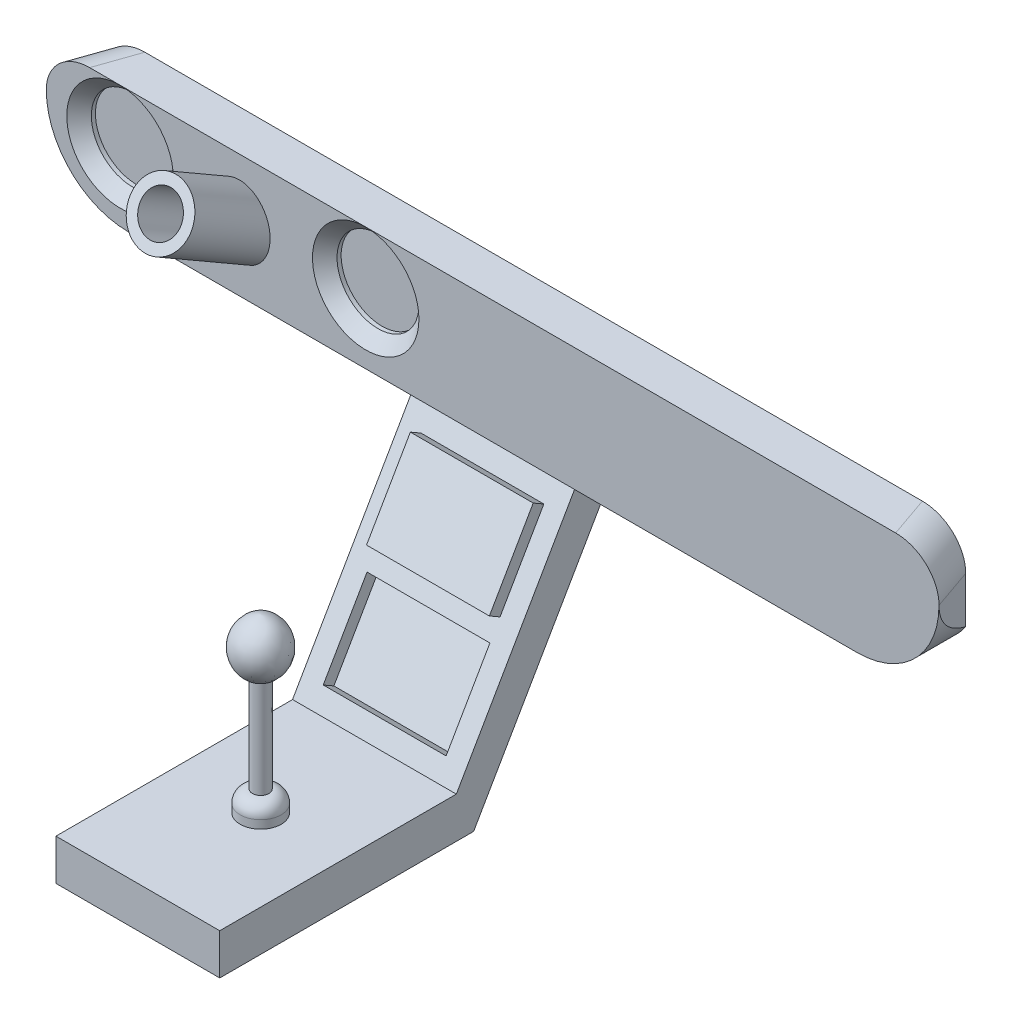
ISO-10303-21;
HEADER;
FILE_DESCRIPTION(('STEP AP214'),'2;1');
FILE_NAME('part.step','',(''),(''),'','','');
FILE_SCHEMA(('AUTOMOTIVE_DESIGN { 1 0 10303 214 1 1 1 1 }'));
ENDSEC;
DATA;
#1=APPLICATION_CONTEXT('core data for automotive mechanical design processes');
#2=APPLICATION_PROTOCOL_DEFINITION('international standard','automotive_design',2000,#1);
#3=PRODUCT_CONTEXT('',#1,'mechanical');
#4=PRODUCT('Part','Part','',(#3));
#5=PRODUCT_RELATED_PRODUCT_CATEGORY('part','',(#4));
#6=PRODUCT_DEFINITION_FORMATION('','',#4);
#7=PRODUCT_DEFINITION_CONTEXT('part definition',#1,'design');
#8=PRODUCT_DEFINITION('design','',#6,#7);
#9=PRODUCT_DEFINITION_SHAPE('','',#8);
#10=(LENGTH_UNIT() NAMED_UNIT(*) SI_UNIT(.MILLI.,.METRE.));
#11=(NAMED_UNIT(*) PLANE_ANGLE_UNIT() SI_UNIT($,.RADIAN.));
#12=(NAMED_UNIT(*) SI_UNIT($,.STERADIAN.) SOLID_ANGLE_UNIT());
#13=UNCERTAINTY_MEASURE_WITH_UNIT(LENGTH_MEASURE(1.E-05),#10,'distance_accuracy_value','');
#14=(GEOMETRIC_REPRESENTATION_CONTEXT(3) GLOBAL_UNCERTAINTY_ASSIGNED_CONTEXT((#13)) GLOBAL_UNIT_ASSIGNED_CONTEXT((#10,
#11,#12)) REPRESENTATION_CONTEXT('',''));
#15=CARTESIAN_POINT('',(0.,0.,0.));
#16=DIRECTION('',(0.,0.,1.));
#17=DIRECTION('',(1.,0.,0.));
#18=AXIS2_PLACEMENT_3D('',#15,#16,#17);
#19=CARTESIAN_POINT('',(109.,15.,5.));
#20=DIRECTION('',(0.,-1.,0.));
#21=DIRECTION('',(1.,0.,0.));
#22=AXIS2_PLACEMENT_3D('',#19,#20,#21);
#23=PLANE('',#22);
#24=DIRECTION('',(-1.,0.,0.));
#25=VECTOR('',#24,1.);
#26=CARTESIAN_POINT('',(109.,15.,5.));
#27=LINE('',#26,#25);
#28=CARTESIAN_POINT('',(98.4117801307302,15.,5.));
#29=VERTEX_POINT('',#28);
#30=CARTESIAN_POINT('',(-31.,15.,5.));
#31=VERTEX_POINT('',#30);
#32=EDGE_CURVE('E213',#29,#31,#27,.T.);
#33=ORIENTED_EDGE('',*,*,#32,.F.);
#34=DIRECTION('',(-0.328667145466067,0.,-0.94444582030479));
#35=VECTOR('',#34,1.);
#36=CARTESIAN_POINT('',(96.0755417969521,15.,-1.71332854533933));
#37=LINE('',#36,#35);
#38=CARTESIAN_POINT('',(94.9317801307302,15.,-5.));
#39=VERTEX_POINT('',#38);
#40=EDGE_CURVE('E195',#29,#39,#37,.T.);
#41=ORIENTED_EDGE('',*,*,#40,.T.);
#42=DIRECTION('',(-1.,0.,0.));
#43=VECTOR('',#42,1.);
#44=CARTESIAN_POINT('',(109.,15.,-5.));
#45=LINE('',#44,#43);
#46=CARTESIAN_POINT('',(-94.9317801307302,15.,-5.));
#47=VERTEX_POINT('',#46);
#48=EDGE_CURVE('E257',#39,#47,#45,.T.);
#49=ORIENTED_EDGE('',*,*,#48,.T.);
#50=DIRECTION('',(0.328667145466067,0.,-0.94444582030479));
#51=VECTOR('',#50,1.);
#52=CARTESIAN_POINT('',(-76.006725630031,15.,-59.3823405192507));
#53=LINE('',#52,#51);
#54=CARTESIAN_POINT('',(-98.4117801307302,15.,5.));
#55=VERTEX_POINT('',#54);
#56=EDGE_CURVE('E250',#47,#55,#53,.F.);
#57=ORIENTED_EDGE('',*,*,#56,.T.);
#58=CARTESIAN_POINT('',(-91.,15.,5.));
#59=VERTEX_POINT('',#58);
#60=EDGE_CURVE('E271',#59,#55,#27,.T.);
#61=ORIENTED_EDGE('',*,*,#60,.F.);
#62=EDGE_CURVE('E270',#31,#59,#27,.T.);
#63=ORIENTED_EDGE('',*,*,#62,.F.);
#64=EDGE_LOOP('',(#33,#41,#49,#57,#61,#63));
#65=FACE_BOUND('',#64,.T.);
#66=ADVANCED_FACE('F37',(#65),#23,.F.);
#67=CARTESIAN_POINT('',(0.,0.,-5.));
#68=DIRECTION('',(0.,0.,1.));
#69=DIRECTION('',(1.,0.,0.));
#70=AXIS2_PLACEMENT_3D('',#67,#68,#69);
#71=PLANE('',#70);
#72=CARTESIAN_POINT('',(-61.85,-4.8867513459481,-5.));
#73=DIRECTION('',(0.,0.,1.));
#74=DIRECTION('',(0.,1.,0.));
#75=AXIS2_PLACEMENT_3D('',#72,#73,#74);
#76=ELLIPSE('',#75,8.66025403784438,7.50000000000001);
#77=CARTESIAN_POINT('',(-61.85,3.77350269189628,-5.));
#78=VERTEX_POINT('',#77);
#79=EDGE_CURVE('E234',#78,#78,#76,.F.);
#80=ORIENTED_EDGE('',*,*,#79,.F.);
#81=EDGE_LOOP('',(#80));
#82=FACE_BOUND('',#81,.T.);
#83=ORIENTED_EDGE('',*,*,#48,.F.);
#84=CARTESIAN_POINT('',(94.9317801307302,5.00000000000001,-5.));
#85=DIRECTION('',(0.,0.,1.));
#86=DIRECTION('',(1.,0.,0.));
#87=AXIS2_PLACEMENT_3D('',#84,#85,#86);
#88=ELLIPSE('',#87,10.5882198692698,10.);
#89=CARTESIAN_POINT('',(105.52,5.00000000000001,-5.));
#90=VERTEX_POINT('',#89);
#91=EDGE_CURVE('E52',#39,#90,#88,.F.);
#92=ORIENTED_EDGE('',*,*,#91,.T.);
#93=DIRECTION('',(0.,1.,0.));
#94=VECTOR('',#93,1.);
#95=CARTESIAN_POINT('',(105.52,-25.,-5.));
#96=LINE('',#95,#94);
#97=CARTESIAN_POINT('',(105.52,-6.27340232582859,-5.));
#98=VERTEX_POINT('',#97);
#99=EDGE_CURVE('E190',#98,#90,#96,.T.);
#100=ORIENTED_EDGE('',*,*,#99,.F.);
#101=CARTESIAN_POINT('',(89.,5.00000000000002,-5.));
#102=DIRECTION('',(0.,0.,1.));
#103=DIRECTION('',(1.,0.,0.));
#104=AXIS2_PLACEMENT_3D('',#101,#102,#103);
#105=CIRCLE('',#104,20.);
#106=CARTESIAN_POINT('',(89.,-15.,-5.));
#107=VERTEX_POINT('',#106);
#108=EDGE_CURVE('E199',#98,#107,#105,.F.);
#109=ORIENTED_EDGE('',*,*,#108,.T.);
#110=DIRECTION('',(1.,0.,0.));
#111=VECTOR('',#110,1.);
#112=CARTESIAN_POINT('',(109.,-15.,-5.));
#113=LINE('',#112,#111);
#114=CARTESIAN_POINT('',(20.,-15.,-5.));
#115=VERTEX_POINT('',#114);
#116=EDGE_CURVE('E267',#115,#107,#113,.T.);
#117=ORIENTED_EDGE('',*,*,#116,.F.);
#118=DIRECTION('',(-1.,0.,0.));
#119=VECTOR('',#118,1.);
#120=CARTESIAN_POINT('',(20.,-15.,-5.));
#121=LINE('',#120,#119);
#122=CARTESIAN_POINT('',(-20.,-15.,-5.));
#123=VERTEX_POINT('',#122);
#124=EDGE_CURVE('E295',#115,#123,#121,.T.);
#125=ORIENTED_EDGE('',*,*,#124,.T.);
#126=CARTESIAN_POINT('',(-89.,-15.,-5.));
#127=VERTEX_POINT('',#126);
#128=EDGE_CURVE('E263',#127,#123,#113,.T.);
#129=ORIENTED_EDGE('',*,*,#128,.F.);
#130=CARTESIAN_POINT('',(-89.,4.99999999999999,-5.));
#131=DIRECTION('',(0.,0.,1.));
#132=DIRECTION('',(1.,0.,0.));
#133=AXIS2_PLACEMENT_3D('',#130,#131,#132);
#134=CIRCLE('',#133,20.);
#135=CARTESIAN_POINT('',(-105.52,-6.27340232582872,-5.));
#136=VERTEX_POINT('',#135);
#137=EDGE_CURVE('E208',#127,#136,#134,.F.);
#138=ORIENTED_EDGE('',*,*,#137,.T.);
#139=DIRECTION('',(0.,1.,0.));
#140=VECTOR('',#139,1.);
#141=CARTESIAN_POINT('',(-105.52,-25.,-5.));
#142=LINE('',#141,#140);
#143=CARTESIAN_POINT('',(-105.52,4.99999999999999,-5.));
#144=VERTEX_POINT('',#143);
#145=EDGE_CURVE('E201',#136,#144,#142,.T.);
#146=ORIENTED_EDGE('',*,*,#145,.T.);
#147=CARTESIAN_POINT('',(-94.9317801307302,4.99999999999999,-5.));
#148=DIRECTION('',(0.,0.,1.));
#149=DIRECTION('',(1.,0.,0.));
#150=AXIS2_PLACEMENT_3D('',#147,#148,#149);
#151=ELLIPSE('',#150,10.5882198692698,10.);
#152=EDGE_CURVE('E247',#144,#47,#151,.F.);
#153=ORIENTED_EDGE('',*,*,#152,.T.);
#154=EDGE_LOOP('',(#83,#92,#100,#109,#117,#125,#129,#138,#146,#153));
#155=FACE_BOUND('',#154,.T.);
#156=ADVANCED_FACE('F198',(#82,#155),#71,.F.);
#157=CARTESIAN_POINT('',(89.,5.00000000000002,5.));
#158=DIRECTION('',(0.,0.,-1.));
#159=DIRECTION('',(-1.,0.,0.));
#160=AXIS2_PLACEMENT_3D('',#157,#158,#159);
#161=CYLINDRICAL_SURFACE('',#160,20.);
#162=ORIENTED_EDGE('',*,*,#108,.F.);
#163=CARTESIAN_POINT('',(89.,5.00000000000002,-52.4712643678163));
#164=DIRECTION('',(0.94444582030479,0.,-0.328667145466067));
#165=DIRECTION('',(-0.328667145466067,0.,-0.94444582030479));
#166=AXIS2_PLACEMENT_3D('',#163,#164,#165);
#167=ELLIPSE('',#166,60.8518383291369,20.);
#168=CARTESIAN_POINT('',(109.,5.00000000000002,5.));
#169=VERTEX_POINT('',#168);
#170=EDGE_CURVE('E188',#98,#169,#167,.F.);
#171=ORIENTED_EDGE('',*,*,#170,.T.);
#172=CARTESIAN_POINT('',(89.,5.00000000000002,5.));
#173=DIRECTION('',(0.,0.,1.));
#174=DIRECTION('',(1.,0.,0.));
#175=AXIS2_PLACEMENT_3D('',#172,#173,#174);
#176=CIRCLE('',#175,20.);
#177=CARTESIAN_POINT('',(89.,-15.,5.));
#178=VERTEX_POINT('',#177);
#179=EDGE_CURVE('E220',#178,#169,#176,.T.);
#180=ORIENTED_EDGE('',*,*,#179,.F.);
#181=DIRECTION('',(0.,0.,-1.));
#182=VECTOR('',#181,1.);
#183=CARTESIAN_POINT('',(89.,-15.,5.));
#184=LINE('',#183,#182);
#185=EDGE_CURVE('E206',#107,#178,#184,.F.);
#186=ORIENTED_EDGE('',*,*,#185,.F.);
#187=EDGE_LOOP('',(#162,#171,#180,#186));
#188=FACE_BOUND('',#187,.T.);
#189=ADVANCED_FACE('F204',(#188),#161,.T.);
#190=CARTESIAN_POINT('',(20.,-15.,5.));
#191=DIRECTION('',(0.,-0.499999999999998,-0.86602540378444));
#192=DIRECTION('',(0.,0.86602540378444,-0.499999999999998));
#193=AXIS2_PLACEMENT_3D('',#190,#191,#192);
#194=PLANE('',#193);
#195=DIRECTION('',(0.,-0.86602540378444,0.499999999999998));
#196=VECTOR('',#195,1.);
#197=CARTESIAN_POINT('',(-20.,-15.,5.));
#198=LINE('',#197,#196);
#199=CARTESIAN_POINT('',(-20.,-15.,5.));
#200=VERTEX_POINT('',#199);
#201=CARTESIAN_POINT('',(-20.,-65.,33.8675134594811));
#202=VERTEX_POINT('',#201);
#203=EDGE_CURVE('E320',#200,#202,#198,.T.);
#204=ORIENTED_EDGE('',*,*,#203,.T.);
#205=DIRECTION('',(-1.,0.,0.));
#206=VECTOR('',#205,1.);
#207=CARTESIAN_POINT('',(20.,-65.,33.8675134594811));
#208=LINE('',#207,#206);
#209=CARTESIAN_POINT('',(20.,-65.,33.8675134594811));
#210=VERTEX_POINT('',#209);
#211=EDGE_CURVE('E300',#210,#202,#208,.T.);
#212=ORIENTED_EDGE('',*,*,#211,.F.);
#213=DIRECTION('',(0.,-0.86602540378444,0.499999999999998));
#214=VECTOR('',#213,1.);
#215=CARTESIAN_POINT('',(20.,-15.,5.));
#216=LINE('',#215,#214);
#217=CARTESIAN_POINT('',(20.,-15.,5.));
#218=VERTEX_POINT('',#217);
#219=EDGE_CURVE('E333',#218,#210,#216,.T.);
#220=ORIENTED_EDGE('',*,*,#219,.F.);
#221=DIRECTION('',(-1.,0.,0.));
#222=VECTOR('',#221,1.);
#223=CARTESIAN_POINT('',(20.,-15.,5.));
#224=LINE('',#223,#222);
#225=EDGE_CURVE('E297',#218,#200,#224,.T.);
#226=ORIENTED_EDGE('',*,*,#225,.T.);
#227=EDGE_LOOP('',(#204,#212,#220,#226));
#228=FACE_BOUND('',#227,.T.);
#229=DIRECTION('',(-1.,0.,0.));
#230=VECTOR('',#229,1.);
#231=CARTESIAN_POINT('',(0.,-37.8630706599092,18.1999999999999));
#232=LINE('',#231,#230);
#233=CARTESIAN_POINT('',(15.,-37.8630706599092,18.1999999999999));
#234=VERTEX_POINT('',#233);
#235=CARTESIAN_POINT('',(-15.,-37.8630706599092,18.1999999999999));
#236=VERTEX_POINT('',#235);
#237=EDGE_CURVE('E359',#234,#236,#232,.T.);
#238=ORIENTED_EDGE('',*,*,#237,.T.);
#239=DIRECTION('',(0.,0.86602540378444,-0.499999999999998));
#240=VECTOR('',#239,1.);
#241=CARTESIAN_POINT('',(-15.,-1.58493649053887,-2.74519052838325));
#242=LINE('',#241,#240);
#243=CARTESIAN_POINT('',(-15.,-19.3301270189222,7.49999999999999));
#244=VERTEX_POINT('',#243);
#245=EDGE_CURVE('E361',#236,#244,#242,.T.);
#246=ORIENTED_EDGE('',*,*,#245,.T.);
#247=DIRECTION('',(-1.,0.,0.));
#248=VECTOR('',#247,1.);
#249=CARTESIAN_POINT('',(0.,-19.3301270189222,7.49999999999999));
#250=LINE('',#249,#248);
#251=CARTESIAN_POINT('',(15.,-19.3301270189222,7.49999999999999));
#252=VERTEX_POINT('',#251);
#253=EDGE_CURVE('E352',#252,#244,#250,.T.);
#254=ORIENTED_EDGE('',*,*,#253,.F.);
#255=DIRECTION('',(0.,0.86602540378444,-0.499999999999998));
#256=VECTOR('',#255,1.);
#257=CARTESIAN_POINT('',(15.,-1.58493649053887,-2.74519052838325));
#258=LINE('',#257,#256);
#259=EDGE_CURVE('E356',#234,#252,#258,.T.);
#260=ORIENTED_EDGE('',*,*,#259,.F.);
#261=EDGE_LOOP('',(#238,#246,#254,#260));
#262=FACE_BOUND('',#261,.T.);
#263=DIRECTION('',(0.,0.86602540378444,-0.499999999999998));
#264=VECTOR('',#263,1.);
#265=CARTESIAN_POINT('',(-15.,-1.58493649053887,-2.74519052838325));
#266=LINE('',#265,#264);
#267=CARTESIAN_POINT('',(-15.,-60.6698729810778,31.3675134594811));
#268=VERTEX_POINT('',#267);
#269=CARTESIAN_POINT('',(-15.,-42.1369293400908,20.6675134594812));
#270=VERTEX_POINT('',#269);
#271=EDGE_CURVE('E391',#268,#270,#266,.T.);
#272=ORIENTED_EDGE('',*,*,#271,.T.);
#273=DIRECTION('',(-1.,0.,0.));
#274=VECTOR('',#273,1.);
#275=CARTESIAN_POINT('',(0.,-42.1369293400908,20.6675134594812));
#276=LINE('',#275,#274);
#277=CARTESIAN_POINT('',(15.,-42.1369293400908,20.6675134594812));
#278=VERTEX_POINT('',#277);
#279=EDGE_CURVE('E381',#278,#270,#276,.T.);
#280=ORIENTED_EDGE('',*,*,#279,.F.);
#281=DIRECTION('',(0.,0.86602540378444,-0.499999999999998));
#282=VECTOR('',#281,1.);
#283=CARTESIAN_POINT('',(15.,-1.58493649053887,-2.74519052838325));
#284=LINE('',#283,#282);
#285=CARTESIAN_POINT('',(15.,-60.6698729810778,31.3675134594811));
#286=VERTEX_POINT('',#285);
#287=EDGE_CURVE('E385',#286,#278,#284,.T.);
#288=ORIENTED_EDGE('',*,*,#287,.F.);
#289=DIRECTION('',(-1.,0.,0.));
#290=VECTOR('',#289,1.);
#291=CARTESIAN_POINT('',(0.,-60.6698729810778,31.3675134594811));
#292=LINE('',#291,#290);
#293=EDGE_CURVE('E388',#286,#268,#292,.T.);
#294=ORIENTED_EDGE('',*,*,#293,.T.);
#295=EDGE_LOOP('',(#272,#280,#288,#294));
#296=FACE_BOUND('',#295,.T.);
#297=ADVANCED_FACE('F474',(#228,#262,#296),#194,.F.);
#298=CARTESIAN_POINT('',(109.,-15.,5.));
#299=DIRECTION('',(0.,1.,0.));
#300=DIRECTION('',(-1.,0.,0.));
#301=AXIS2_PLACEMENT_3D('',#298,#299,#300);
#302=PLANE('',#301);
#303=DIRECTION('',(0.,0.,1.));
#304=VECTOR('',#303,1.);
#305=CARTESIAN_POINT('',(20.,-15.,-5.));
#306=LINE('',#305,#304);
#307=EDGE_CURVE('E335',#115,#218,#306,.T.);
#308=ORIENTED_EDGE('',*,*,#307,.F.);
#309=ORIENTED_EDGE('',*,*,#116,.T.);
#310=ORIENTED_EDGE('',*,*,#185,.T.);
#311=DIRECTION('',(1.,0.,0.));
#312=VECTOR('',#311,1.);
#313=CARTESIAN_POINT('',(109.,-15.,5.));
#314=LINE('',#313,#312);
#315=EDGE_CURVE('E262',#218,#178,#314,.T.);
#316=ORIENTED_EDGE('',*,*,#315,.F.);
#317=EDGE_LOOP('',(#308,#309,#310,#316));
#318=FACE_BOUND('',#317,.T.);
#319=ADVANCED_FACE('F470',(#318),#302,.F.);
#320=ORIENTED_EDGE('',*,*,#128,.T.);
#321=DIRECTION('',(0.,0.,1.));
#322=VECTOR('',#321,1.);
#323=CARTESIAN_POINT('',(-20.,-15.,-5.));
#324=LINE('',#323,#322);
#325=EDGE_CURVE('E322',#123,#200,#324,.T.);
#326=ORIENTED_EDGE('',*,*,#325,.T.);
#327=CARTESIAN_POINT('',(-89.,-15.,5.));
#328=VERTEX_POINT('',#327);
#329=EDGE_CURVE('E264',#328,#200,#314,.T.);
#330=ORIENTED_EDGE('',*,*,#329,.F.);
#331=DIRECTION('',(0.,0.,-1.));
#332=VECTOR('',#331,1.);
#333=CARTESIAN_POINT('',(-89.,-15.,5.));
#334=LINE('',#333,#332);
#335=EDGE_CURVE('E207',#328,#127,#334,.T.);
#336=ORIENTED_EDGE('',*,*,#335,.T.);
#337=EDGE_LOOP('',(#320,#326,#330,#336));
#338=FACE_BOUND('',#337,.T.);
#339=ADVANCED_FACE('F467',(#338),#302,.F.);
#340=CARTESIAN_POINT('',(0.,0.,5.));
#341=DIRECTION('',(0.,0.,1.));
#342=DIRECTION('',(1.,0.,0.));
#343=AXIS2_PLACEMENT_3D('',#340,#341,#342);
#344=PLANE('',#343);
#345=CARTESIAN_POINT('',(-61.85,0.886751345948126,5.));
#346=DIRECTION('',(0.,0.,1.));
#347=DIRECTION('',(0.,1.,0.));
#348=AXIS2_PLACEMENT_3D('',#345,#346,#347);
#349=ELLIPSE('',#348,8.66025403784438,7.50000000000001);
#350=CARTESIAN_POINT('',(-61.85,9.5470053837925,5.));
#351=VERTEX_POINT('',#350);
#352=EDGE_CURVE('E278',#351,#351,#349,.F.);
#353=ORIENTED_EDGE('',*,*,#352,.T.);
#354=EDGE_LOOP('',(#353));
#355=FACE_BOUND('',#354,.T.);
#356=ORIENTED_EDGE('',*,*,#179,.T.);
#357=CARTESIAN_POINT('',(98.4117801307302,5.00000000000001,5.));
#358=DIRECTION('',(0.,0.,1.));
#359=DIRECTION('',(1.,0.,0.));
#360=AXIS2_PLACEMENT_3D('',#357,#358,#359);
#361=ELLIPSE('',#360,10.5882198692698,10.);
#362=EDGE_CURVE('E11',#169,#29,#361,.T.);
#363=ORIENTED_EDGE('',*,*,#362,.T.);
#364=ORIENTED_EDGE('',*,*,#32,.T.);
#365=CARTESIAN_POINT('',(-31.,2.00000000000002,5.));
#366=DIRECTION('',(0.,0.,1.));
#367=DIRECTION('',(1.,0.,0.));
#368=AXIS2_PLACEMENT_3D('',#365,#366,#367);
#369=CIRCLE('',#368,13.0000000000001);
#370=EDGE_CURVE('E228',#31,#31,#369,.F.);
#371=ORIENTED_EDGE('',*,*,#370,.T.);
#372=ORIENTED_EDGE('',*,*,#62,.T.);
#373=CARTESIAN_POINT('',(-91.,2.00000000000002,5.));
#374=DIRECTION('',(0.,0.,1.));
#375=DIRECTION('',(1.,0.,0.));
#376=AXIS2_PLACEMENT_3D('',#373,#374,#375);
#377=CIRCLE('',#376,13.0000000000001);
#378=EDGE_CURVE('E225',#59,#59,#377,.F.);
#379=ORIENTED_EDGE('',*,*,#378,.T.);
#380=ORIENTED_EDGE('',*,*,#60,.T.);
#381=CARTESIAN_POINT('',(-98.4117801307302,4.99999999999999,5.));
#382=DIRECTION('',(0.,0.,1.));
#383=DIRECTION('',(1.,0.,0.));
#384=AXIS2_PLACEMENT_3D('',#381,#382,#383);
#385=ELLIPSE('',#384,10.5882198692698,10.);
#386=CARTESIAN_POINT('',(-109.,4.99999999999999,5.));
#387=VERTEX_POINT('',#386);
#388=EDGE_CURVE('E196',#55,#387,#385,.T.);
#389=ORIENTED_EDGE('',*,*,#388,.T.);
#390=CARTESIAN_POINT('',(-89.,4.99999999999999,5.));
#391=DIRECTION('',(0.,0.,1.));
#392=DIRECTION('',(1.,0.,0.));
#393=AXIS2_PLACEMENT_3D('',#390,#391,#392);
#394=CIRCLE('',#393,20.);
#395=EDGE_CURVE('E218',#387,#328,#394,.T.);
#396=ORIENTED_EDGE('',*,*,#395,.T.);
#397=ORIENTED_EDGE('',*,*,#329,.T.);
#398=ORIENTED_EDGE('',*,*,#225,.F.);
#399=ORIENTED_EDGE('',*,*,#315,.T.);
#400=EDGE_LOOP('',(#356,#363,#364,#371,#372,#379,#380,#389,#396,#397,#398,#399));
#401=FACE_BOUND('',#400,.T.);
#402=ADVANCED_FACE('F432',(#355,#401),#344,.T.);
#403=CARTESIAN_POINT('',(-89.,4.99999999999999,5.));
#404=DIRECTION('',(0.,0.,-1.));
#405=DIRECTION('',(-1.,0.,0.));
#406=AXIS2_PLACEMENT_3D('',#403,#404,#405);
#407=CYLINDRICAL_SURFACE('',#406,20.);
#408=CARTESIAN_POINT('',(-89.,4.99999999999999,-52.4712643678161));
#409=DIRECTION('',(0.94444582030479,0.,0.328667145466067));
#410=DIRECTION('',(0.328667145466067,0.,-0.94444582030479));
#411=AXIS2_PLACEMENT_3D('',#408,#409,#410);
#412=ELLIPSE('',#411,60.8518383291369,20.);
#413=EDGE_CURVE('E241',#136,#387,#412,.F.);
#414=ORIENTED_EDGE('',*,*,#413,.F.);
#415=ORIENTED_EDGE('',*,*,#137,.F.);
#416=ORIENTED_EDGE('',*,*,#335,.F.);
#417=ORIENTED_EDGE('',*,*,#395,.F.);
#418=EDGE_LOOP('',(#414,#415,#416,#417));
#419=FACE_BOUND('',#418,.T.);
#420=ADVANCED_FACE('F423',(#419),#407,.T.);
#421=CARTESIAN_POINT('',(-31.,2.00000000000002,1.));
#422=DIRECTION('',(0.,0.,1.));
#423=DIRECTION('',(1.,0.,0.));
#424=AXIS2_PLACEMENT_3D('',#421,#422,#423);
#425=CYLINDRICAL_SURFACE('',#424,10.);
#426=CARTESIAN_POINT('',(-31.,2.00000000000002,1.99999999999995));
#427=DIRECTION('',(0.,0.,1.));
#428=DIRECTION('',(1.,0.,0.));
#429=AXIS2_PLACEMENT_3D('',#426,#427,#428);
#430=CIRCLE('',#429,10.);
#431=CARTESIAN_POINT('',(-21.,2.00000000000002,1.99999999999995));
#432=VERTEX_POINT('',#431);
#433=EDGE_CURVE('E222',#432,#432,#430,.T.);
#434=ORIENTED_EDGE('',*,*,#433,.T.);
#435=EDGE_LOOP('',(#434));
#436=FACE_BOUND('',#435,.T.);
#437=CARTESIAN_POINT('',(-31.,2.00000000000002,1.));
#438=DIRECTION('',(0.,0.,1.));
#439=DIRECTION('',(1.,0.,0.));
#440=AXIS2_PLACEMENT_3D('',#437,#438,#439);
#441=CIRCLE('',#440,10.);
#442=CARTESIAN_POINT('',(-21.,2.00000000000002,1.));
#443=VERTEX_POINT('',#442);
#444=EDGE_CURVE('E274',#443,#443,#441,.T.);
#445=ORIENTED_EDGE('',*,*,#444,.F.);
#446=EDGE_LOOP('',(#445));
#447=FACE_BOUND('',#446,.T.);
#448=ADVANCED_FACE('F443',(#436,#447),#425,.F.);
#449=CARTESIAN_POINT('',(-31.,2.00000000000002,1.));
#450=DIRECTION('',(0.,0.,1.));
#451=DIRECTION('',(1.,0.,0.));
#452=AXIS2_PLACEMENT_3D('',#449,#450,#451);
#453=PLANE('',#452);
#454=ORIENTED_EDGE('',*,*,#444,.T.);
#455=EDGE_LOOP('',(#454));
#456=FACE_BOUND('',#455,.T.);
#457=ADVANCED_FACE('F446',(#456),#453,.T.);
#458=CARTESIAN_POINT('',(-91.,2.00000000000002,1.));
#459=DIRECTION('',(0.,0.,1.));
#460=DIRECTION('',(1.,0.,0.));
#461=AXIS2_PLACEMENT_3D('',#458,#459,#460);
#462=CYLINDRICAL_SURFACE('',#461,9.99999999999999);
#463=CARTESIAN_POINT('',(-91.,2.00000000000002,1.99999999999995));
#464=DIRECTION('',(0.,0.,1.));
#465=DIRECTION('',(1.,0.,0.));
#466=AXIS2_PLACEMENT_3D('',#463,#464,#465);
#467=CIRCLE('',#466,9.99999999999999);
#468=CARTESIAN_POINT('',(-81.,2.00000000000002,1.99999999999995));
#469=VERTEX_POINT('',#468);
#470=EDGE_CURVE('E231',#469,#469,#467,.T.);
#471=ORIENTED_EDGE('',*,*,#470,.T.);
#472=EDGE_LOOP('',(#471));
#473=FACE_BOUND('',#472,.T.);
#474=CARTESIAN_POINT('',(-91.,2.00000000000002,1.));
#475=DIRECTION('',(0.,0.,1.));
#476=DIRECTION('',(1.,0.,0.));
#477=AXIS2_PLACEMENT_3D('',#474,#475,#476);
#478=CIRCLE('',#477,9.99999999999999);
#479=CARTESIAN_POINT('',(-81.,2.00000000000002,1.));
#480=VERTEX_POINT('',#479);
#481=EDGE_CURVE('E277',#480,#480,#478,.T.);
#482=ORIENTED_EDGE('',*,*,#481,.F.);
#483=EDGE_LOOP('',(#482));
#484=FACE_BOUND('',#483,.T.);
#485=ADVANCED_FACE('F451',(#473,#484),#462,.F.);
#486=CARTESIAN_POINT('',(-91.,2.00000000000002,1.));
#487=DIRECTION('',(0.,0.,1.));
#488=DIRECTION('',(1.,0.,0.));
#489=AXIS2_PLACEMENT_3D('',#486,#487,#488);
#490=PLANE('',#489);
#491=ORIENTED_EDGE('',*,*,#481,.T.);
#492=EDGE_LOOP('',(#491));
#493=FACE_BOUND('',#492,.T.);
#494=ADVANCED_FACE('F439',(#493),#490,.T.);
#495=CARTESIAN_POINT('',(-31.,2.00000000000002,1.99999999999995));
#496=DIRECTION('',(0.,0.,1.));
#497=DIRECTION('',(1.,0.,0.));
#498=AXIS2_PLACEMENT_3D('',#495,#496,#497);
#499=CONICAL_SURFACE('',#498,10.,0.785398163397452);
#500=ORIENTED_EDGE('',*,*,#370,.F.);
#501=EDGE_LOOP('',(#500));
#502=FACE_BOUND('',#501,.T.);
#503=ORIENTED_EDGE('',*,*,#433,.F.);
#504=EDGE_LOOP('',(#503));
#505=FACE_BOUND('',#504,.T.);
#506=ADVANCED_FACE('F435',(#502,#505),#499,.F.);
#507=CARTESIAN_POINT('',(-91.,2.00000000000002,1.99999999999995));
#508=DIRECTION('',(0.,0.,1.));
#509=DIRECTION('',(1.,0.,0.));
#510=AXIS2_PLACEMENT_3D('',#507,#508,#509);
#511=CONICAL_SURFACE('',#510,9.99999999999999,0.785398163397452);
#512=ORIENTED_EDGE('',*,*,#378,.F.);
#513=EDGE_LOOP('',(#512));
#514=FACE_BOUND('',#513,.T.);
#515=ORIENTED_EDGE('',*,*,#470,.F.);
#516=EDGE_LOOP('',(#515));
#517=FACE_BOUND('',#516,.T.);
#518=ADVANCED_FACE('F438',(#514,#517),#511,.F.);
#519=CARTESIAN_POINT('',(-61.85,-1.50480947161665,-14.1423048454133));
#520=DIRECTION('',(0.,0.499999999999998,0.86602540378444));
#521=DIRECTION('',(0.,-0.86602540378444,0.499999999999998));
#522=AXIS2_PLACEMENT_3D('',#519,#520,#521);
#523=PLANE('',#522);
#524=CARTESIAN_POINT('',(-61.85,-7.99999999999996,-10.3923048454133));
#525=DIRECTION('',(0.,0.499999999999998,0.86602540378444));
#526=DIRECTION('',(0.,-0.86602540378444,0.499999999999998));
#527=AXIS2_PLACEMENT_3D('',#524,#525,#526);
#528=CIRCLE('',#527,5.);
#529=CARTESIAN_POINT('',(-61.85,-12.3301270189222,-7.89230484541329));
#530=VERTEX_POINT('',#529);
#531=EDGE_CURVE('E289',#530,#530,#528,.T.);
#532=ORIENTED_EDGE('',*,*,#531,.T.);
#533=EDGE_LOOP('',(#532));
#534=FACE_BOUND('',#533,.T.);
#535=CARTESIAN_POINT('',(-61.85,-7.99999999999996,-10.3923048454133));
#536=DIRECTION('',(0.,0.499999999999998,0.86602540378444));
#537=DIRECTION('',(0.,-0.86602540378444,0.499999999999998));
#538=AXIS2_PLACEMENT_3D('',#535,#536,#537);
#539=CIRCLE('',#538,7.50000000000001);
#540=CARTESIAN_POINT('',(-61.85,-14.4951905283833,-6.6423048454133));
#541=VERTEX_POINT('',#540);
#542=EDGE_CURVE('E283',#541,#541,#539,.T.);
#543=ORIENTED_EDGE('',*,*,#542,.F.);
#544=EDGE_LOOP('',(#543));
#545=FACE_BOUND('',#544,.T.);
#546=ADVANCED_FACE('F478',(#534,#545),#523,.F.);
#547=CARTESIAN_POINT('',(-61.85,12.,24.2487113059643));
#548=DIRECTION('',(0.,0.499999999999998,0.86602540378444));
#549=DIRECTION('',(0.,-0.86602540378444,0.499999999999998));
#550=AXIS2_PLACEMENT_3D('',#547,#548,#549);
#551=CYLINDRICAL_SURFACE('',#550,7.50000000000001);
#552=ORIENTED_EDGE('',*,*,#542,.T.);
#553=EDGE_LOOP('',(#552));
#554=FACE_BOUND('',#553,.T.);
#555=ORIENTED_EDGE('',*,*,#79,.T.);
#556=EDGE_LOOP('',(#555));
#557=FACE_BOUND('',#556,.T.);
#558=ADVANCED_FACE('F592',(#554,#557),#551,.T.);
#559=ORIENTED_EDGE('',*,*,#352,.F.);
#560=EDGE_LOOP('',(#559));
#561=FACE_BOUND('',#560,.T.);
#562=CARTESIAN_POINT('',(-61.85,11.9999999999999,24.2487113059643));
#563=DIRECTION('',(0.,0.499999999999998,0.86602540378444));
#564=DIRECTION('',(0.,-0.86602540378444,0.499999999999998));
#565=AXIS2_PLACEMENT_3D('',#562,#563,#564);
#566=CIRCLE('',#565,7.5);
#567=CARTESIAN_POINT('',(-61.85,5.50480947161665,27.9987113059643));
#568=VERTEX_POINT('',#567);
#569=EDGE_CURVE('E286',#568,#568,#566,.T.);
#570=ORIENTED_EDGE('',*,*,#569,.F.);
#571=EDGE_LOOP('',(#570));
#572=FACE_BOUND('',#571,.T.);
#573=ADVANCED_FACE('F588',(#561,#572),#551,.T.);
#574=CARTESIAN_POINT('',(-61.85,18.4951905283832,20.4987113059643));
#575=DIRECTION('',(0.,-0.499999999999998,-0.86602540378444));
#576=DIRECTION('',(0.,0.86602540378444,-0.499999999999998));
#577=AXIS2_PLACEMENT_3D('',#574,#575,#576);
#578=PLANE('',#577);
#579=CARTESIAN_POINT('',(-61.85,12.,24.2487113059643));
#580=DIRECTION('',(0.,0.499999999999998,0.86602540378444));
#581=DIRECTION('',(0.,-0.86602540378444,0.499999999999998));
#582=AXIS2_PLACEMENT_3D('',#579,#580,#581);
#583=CIRCLE('',#582,5.);
#584=CARTESIAN_POINT('',(-61.85,7.66987298107776,26.7487113059643));
#585=VERTEX_POINT('',#584);
#586=EDGE_CURVE('E292',#585,#585,#583,.T.);
#587=ORIENTED_EDGE('',*,*,#586,.F.);
#588=EDGE_LOOP('',(#587));
#589=FACE_BOUND('',#588,.T.);
#590=ORIENTED_EDGE('',*,*,#569,.T.);
#591=EDGE_LOOP('',(#590));
#592=FACE_BOUND('',#591,.T.);
#593=ADVANCED_FACE('F584',(#589,#592),#578,.F.);
#594=CARTESIAN_POINT('',(-61.85,-11.3737976320958,-16.2358937586588));
#595=DIRECTION('',(0.,0.499999999999998,0.86602540378444));
#596=DIRECTION('',(0.,-0.86602540378444,0.499999999999998));
#597=AXIS2_PLACEMENT_3D('',#594,#595,#596);
#598=CYLINDRICAL_SURFACE('',#597,5.);
#599=ORIENTED_EDGE('',*,*,#586,.T.);
#600=EDGE_LOOP('',(#599));
#601=FACE_BOUND('',#600,.T.);
#602=ORIENTED_EDGE('',*,*,#531,.F.);
#603=EDGE_LOOP('',(#602));
#604=FACE_BOUND('',#603,.T.);
#605=ADVANCED_FACE('F580',(#601,#604),#598,.F.);
#606=CARTESIAN_POINT('',(20.,-15.,-5.));
#607=DIRECTION('',(0.,0.499999999999998,0.86602540378444));
#608=DIRECTION('',(0.,-0.86602540378444,0.499999999999998));
#609=AXIS2_PLACEMENT_3D('',#606,#607,#608);
#610=PLANE('',#609);
#611=DIRECTION('',(0.,0.86602540378444,-0.499999999999998));
#612=VECTOR('',#611,1.);
#613=CARTESIAN_POINT('',(-20.,-15.,-5.));
#614=LINE('',#613,#612);
#615=CARTESIAN_POINT('',(-20.,-75.,29.6410161513773));
#616=VERTEX_POINT('',#615);
#617=EDGE_CURVE('E324',#616,#123,#614,.T.);
#618=ORIENTED_EDGE('',*,*,#617,.T.);
#619=ORIENTED_EDGE('',*,*,#124,.F.);
#620=DIRECTION('',(0.,0.86602540378444,-0.499999999999998));
#621=VECTOR('',#620,1.);
#622=CARTESIAN_POINT('',(20.,-15.,-5.));
#623=LINE('',#622,#621);
#624=CARTESIAN_POINT('',(20.,-75.,29.6410161513773));
#625=VERTEX_POINT('',#624);
#626=EDGE_CURVE('E315',#625,#115,#623,.T.);
#627=ORIENTED_EDGE('',*,*,#626,.F.);
#628=DIRECTION('',(-1.,0.,0.));
#629=VECTOR('',#628,1.);
#630=CARTESIAN_POINT('',(20.,-75.,29.6410161513773));
#631=LINE('',#630,#629);
#632=EDGE_CURVE('E309',#625,#616,#631,.T.);
#633=ORIENTED_EDGE('',*,*,#632,.T.);
#634=EDGE_LOOP('',(#618,#619,#627,#633));
#635=FACE_BOUND('',#634,.T.);
#636=ADVANCED_FACE('F573',(#635),#610,.F.);
#637=CARTESIAN_POINT('',(20.,-65.,33.8675134594811));
#638=DIRECTION('',(0.,-1.,0.));
#639=DIRECTION('',(0.,0.,-1.));
#640=AXIS2_PLACEMENT_3D('',#637,#638,#639);
#641=PLANE('',#640);
#642=CARTESIAN_POINT('',(0.,-65.,61.6410161513773));
#643=DIRECTION('',(0.,-1.,0.));
#644=DIRECTION('',(0.,0.,-1.));
#645=AXIS2_PLACEMENT_3D('',#642,#643,#644);
#646=CIRCLE('',#645,5.);
#647=CARTESIAN_POINT('',(0.,-65.,56.6410161513773));
#648=VERTEX_POINT('',#647);
#649=EDGE_CURVE('E240',#648,#648,#646,.F.);
#650=ORIENTED_EDGE('',*,*,#649,.F.);
#651=EDGE_LOOP('',(#650));
#652=FACE_BOUND('',#651,.T.);
#653=DIRECTION('',(0.,0.,1.));
#654=VECTOR('',#653,1.);
#655=CARTESIAN_POINT('',(-20.,-65.,33.8675134594811));
#656=LINE('',#655,#654);
#657=CARTESIAN_POINT('',(-20.,-65.,91.6410161513773));
#658=VERTEX_POINT('',#657);
#659=EDGE_CURVE('E318',#202,#658,#656,.T.);
#660=ORIENTED_EDGE('',*,*,#659,.T.);
#661=DIRECTION('',(-1.,0.,0.));
#662=VECTOR('',#661,1.);
#663=CARTESIAN_POINT('',(20.,-65.,91.6410161513773));
#664=LINE('',#663,#662);
#665=CARTESIAN_POINT('',(20.,-65.,91.6410161513773));
#666=VERTEX_POINT('',#665);
#667=EDGE_CURVE('E303',#666,#658,#664,.T.);
#668=ORIENTED_EDGE('',*,*,#667,.F.);
#669=DIRECTION('',(0.,0.,1.));
#670=VECTOR('',#669,1.);
#671=CARTESIAN_POINT('',(20.,-65.,33.8675134594811));
#672=LINE('',#671,#670);
#673=EDGE_CURVE('E331',#210,#666,#672,.T.);
#674=ORIENTED_EDGE('',*,*,#673,.F.);
#675=ORIENTED_EDGE('',*,*,#211,.T.);
#676=EDGE_LOOP('',(#660,#668,#674,#675));
#677=FACE_BOUND('',#676,.T.);
#678=ADVANCED_FACE('F569',(#652,#677),#641,.F.);
#679=CARTESIAN_POINT('',(20.,-65.,91.6410161513773));
#680=DIRECTION('',(0.,0.,-1.));
#681=DIRECTION('',(-1.,0.,0.));
#682=AXIS2_PLACEMENT_3D('',#679,#680,#681);
#683=PLANE('',#682);
#684=DIRECTION('',(0.,-1.,0.));
#685=VECTOR('',#684,1.);
#686=CARTESIAN_POINT('',(-20.,-65.,91.6410161513773));
#687=LINE('',#686,#685);
#688=CARTESIAN_POINT('',(-20.,-75.,91.6410161513773));
#689=VERTEX_POINT('',#688);
#690=EDGE_CURVE('E316',#658,#689,#687,.T.);
#691=ORIENTED_EDGE('',*,*,#690,.T.);
#692=DIRECTION('',(-1.,0.,0.));
#693=VECTOR('',#692,1.);
#694=CARTESIAN_POINT('',(20.,-75.,91.6410161513773));
#695=LINE('',#694,#693);
#696=CARTESIAN_POINT('',(20.,-75.,91.6410161513773));
#697=VERTEX_POINT('',#696);
#698=EDGE_CURVE('E306',#697,#689,#695,.T.);
#699=ORIENTED_EDGE('',*,*,#698,.F.);
#700=DIRECTION('',(0.,-1.,0.));
#701=VECTOR('',#700,1.);
#702=CARTESIAN_POINT('',(20.,-65.,91.6410161513773));
#703=LINE('',#702,#701);
#704=EDGE_CURVE('E329',#666,#697,#703,.T.);
#705=ORIENTED_EDGE('',*,*,#704,.F.);
#706=ORIENTED_EDGE('',*,*,#667,.T.);
#707=EDGE_LOOP('',(#691,#699,#705,#706));
#708=FACE_BOUND('',#707,.T.);
#709=ADVANCED_FACE('F565',(#708),#683,.F.);
#710=CARTESIAN_POINT('',(20.,-75.,29.6410161513773));
#711=DIRECTION('',(0.,1.,0.));
#712=DIRECTION('',(0.,0.,1.));
#713=AXIS2_PLACEMENT_3D('',#710,#711,#712);
#714=PLANE('',#713);
#715=CARTESIAN_POINT('',(0.,-75.,61.6410161513773));
#716=DIRECTION('',(0.,1.,0.));
#717=DIRECTION('',(0.,0.,1.));
#718=AXIS2_PLACEMENT_3D('',#715,#716,#717);
#719=CIRCLE('',#718,7.5);
#720=CARTESIAN_POINT('',(0.,-75.,69.1410161513773));
#721=VERTEX_POINT('',#720);
#722=EDGE_CURVE('E237',#721,#721,#719,.F.);
#723=ORIENTED_EDGE('',*,*,#722,.F.);
#724=EDGE_LOOP('',(#723));
#725=FACE_BOUND('',#724,.T.);
#726=DIRECTION('',(0.,0.,-1.));
#727=VECTOR('',#726,1.);
#728=CARTESIAN_POINT('',(-20.,-75.,29.6410161513773));
#729=LINE('',#728,#727);
#730=EDGE_CURVE('E313',#689,#616,#729,.T.);
#731=ORIENTED_EDGE('',*,*,#730,.T.);
#732=ORIENTED_EDGE('',*,*,#632,.F.);
#733=DIRECTION('',(0.,0.,-1.));
#734=VECTOR('',#733,1.);
#735=CARTESIAN_POINT('',(20.,-75.,29.6410161513773));
#736=LINE('',#735,#734);
#737=EDGE_CURVE('E312',#697,#625,#736,.T.);
#738=ORIENTED_EDGE('',*,*,#737,.F.);
#739=ORIENTED_EDGE('',*,*,#698,.T.);
#740=EDGE_LOOP('',(#731,#732,#738,#739));
#741=FACE_BOUND('',#740,.T.);
#742=ADVANCED_FACE('F558',(#725,#741),#714,.F.);
#743=CARTESIAN_POINT('',(20.,0.,0.));
#744=DIRECTION('',(-1.,0.,0.));
#745=DIRECTION('',(0.,0.,1.));
#746=AXIS2_PLACEMENT_3D('',#743,#744,#745);
#747=PLANE('',#746);
#748=ORIENTED_EDGE('',*,*,#626,.T.);
#749=ORIENTED_EDGE('',*,*,#307,.T.);
#750=ORIENTED_EDGE('',*,*,#219,.T.);
#751=ORIENTED_EDGE('',*,*,#673,.T.);
#752=ORIENTED_EDGE('',*,*,#704,.T.);
#753=ORIENTED_EDGE('',*,*,#737,.T.);
#754=EDGE_LOOP('',(#748,#749,#750,#751,#752,#753));
#755=FACE_BOUND('',#754,.T.);
#756=ADVANCED_FACE('F555',(#755),#747,.F.);
#757=CARTESIAN_POINT('',(-20.,0.,0.));
#758=DIRECTION('',(-1.,0.,0.));
#759=DIRECTION('',(0.,0.,1.));
#760=AXIS2_PLACEMENT_3D('',#757,#758,#759);
#761=PLANE('',#760);
#762=ORIENTED_EDGE('',*,*,#617,.F.);
#763=ORIENTED_EDGE('',*,*,#730,.F.);
#764=ORIENTED_EDGE('',*,*,#690,.F.);
#765=ORIENTED_EDGE('',*,*,#659,.F.);
#766=ORIENTED_EDGE('',*,*,#203,.F.);
#767=ORIENTED_EDGE('',*,*,#325,.F.);
#768=EDGE_LOOP('',(#762,#763,#764,#765,#766,#767));
#769=FACE_BOUND('',#768,.T.);
#770=ADVANCED_FACE('F553',(#769),#761,.T.);
#771=CARTESIAN_POINT('',(-15.,-0.0849364905388785,-0.147114317029932));
#772=DIRECTION('',(-1.,0.,0.));
#773=DIRECTION('',(0.,0.,1.));
#774=AXIS2_PLACEMENT_3D('',#771,#772,#773);
#775=PLANE('',#774);
#776=ORIENTED_EDGE('',*,*,#245,.F.);
#777=DIRECTION('',(0.,-0.499999999999998,-0.86602540378444));
#778=VECTOR('',#777,1.);
#779=CARTESIAN_POINT('',(-15.,-36.3630706599092,20.7980762113533));
#780=LINE('',#779,#778);
#781=CARTESIAN_POINT('',(-15.,-36.3630706599092,20.7980762113533));
#782=VERTEX_POINT('',#781);
#783=EDGE_CURVE('E327',#782,#236,#780,.T.);
#784=ORIENTED_EDGE('',*,*,#783,.F.);
#785=DIRECTION('',(0.,0.86602540378444,-0.499999999999998));
#786=VECTOR('',#785,1.);
#787=CARTESIAN_POINT('',(-15.,-0.0849364905388785,-0.147114317029932));
#788=LINE('',#787,#786);
#789=CARTESIAN_POINT('',(-15.,-17.8301270189222,10.0980762113533));
#790=VERTEX_POINT('',#789);
#791=EDGE_CURVE('E355',#782,#790,#788,.T.);
#792=ORIENTED_EDGE('',*,*,#791,.T.);
#793=DIRECTION('',(0.,-0.499999999999998,-0.86602540378444));
#794=VECTOR('',#793,1.);
#795=CARTESIAN_POINT('',(-15.,-17.8301270189222,10.0980762113533));
#796=LINE('',#795,#794);
#797=EDGE_CURVE('E348',#790,#244,#796,.T.);
#798=ORIENTED_EDGE('',*,*,#797,.T.);
#799=EDGE_LOOP('',(#776,#784,#792,#798));
#800=FACE_BOUND('',#799,.T.);
#801=ADVANCED_FACE('F549',(#800),#775,.T.);
#802=CARTESIAN_POINT('',(0.,-36.3630706599092,20.7980762113533));
#803=DIRECTION('',(0.,-0.86602540378444,0.499999999999998));
#804=DIRECTION('',(0.,-0.499999999999998,-0.86602540378444));
#805=AXIS2_PLACEMENT_3D('',#802,#803,#804);
#806=PLANE('',#805);
#807=ORIENTED_EDGE('',*,*,#237,.F.);
#808=DIRECTION('',(0.,-0.499999999999998,-0.86602540378444));
#809=VECTOR('',#808,1.);
#810=CARTESIAN_POINT('',(15.,-36.3630706599092,20.7980762113533));
#811=LINE('',#810,#809);
#812=CARTESIAN_POINT('',(15.,-36.3630706599092,20.7980762113533));
#813=VERTEX_POINT('',#812);
#814=EDGE_CURVE('E342',#813,#234,#811,.T.);
#815=ORIENTED_EDGE('',*,*,#814,.F.);
#816=DIRECTION('',(-1.,0.,0.));
#817=VECTOR('',#816,1.);
#818=CARTESIAN_POINT('',(0.,-36.3630706599092,20.7980762113533));
#819=LINE('',#818,#817);
#820=EDGE_CURVE('E367',#813,#782,#819,.T.);
#821=ORIENTED_EDGE('',*,*,#820,.T.);
#822=ORIENTED_EDGE('',*,*,#783,.T.);
#823=EDGE_LOOP('',(#807,#815,#821,#822));
#824=FACE_BOUND('',#823,.T.);
#825=ADVANCED_FACE('F545',(#824),#806,.T.);
#826=CARTESIAN_POINT('',(15.,-0.0849364905388785,-0.147114317029932));
#827=DIRECTION('',(-1.,0.,0.));
#828=DIRECTION('',(0.,0.,1.));
#829=AXIS2_PLACEMENT_3D('',#826,#827,#828);
#830=PLANE('',#829);
#831=ORIENTED_EDGE('',*,*,#259,.T.);
#832=DIRECTION('',(0.,-0.499999999999998,-0.86602540378444));
#833=VECTOR('',#832,1.);
#834=CARTESIAN_POINT('',(15.,-17.8301270189222,10.0980762113533));
#835=LINE('',#834,#833);
#836=CARTESIAN_POINT('',(15.,-17.8301270189222,10.0980762113533));
#837=VERTEX_POINT('',#836);
#838=EDGE_CURVE('E345',#837,#252,#835,.T.);
#839=ORIENTED_EDGE('',*,*,#838,.F.);
#840=DIRECTION('',(0.,0.86602540378444,-0.499999999999998));
#841=VECTOR('',#840,1.);
#842=CARTESIAN_POINT('',(15.,-0.0849364905388785,-0.147114317029932));
#843=LINE('',#842,#841);
#844=EDGE_CURVE('E365',#813,#837,#843,.T.);
#845=ORIENTED_EDGE('',*,*,#844,.F.);
#846=ORIENTED_EDGE('',*,*,#814,.T.);
#847=EDGE_LOOP('',(#831,#839,#845,#846));
#848=FACE_BOUND('',#847,.T.);
#849=ADVANCED_FACE('F541',(#848),#830,.F.);
#850=CARTESIAN_POINT('',(0.,-17.8301270189222,10.0980762113533));
#851=DIRECTION('',(0.,-0.86602540378444,0.499999999999998));
#852=DIRECTION('',(0.,-0.499999999999998,-0.86602540378444));
#853=AXIS2_PLACEMENT_3D('',#850,#851,#852);
#854=PLANE('',#853);
#855=ORIENTED_EDGE('',*,*,#253,.T.);
#856=ORIENTED_EDGE('',*,*,#797,.F.);
#857=DIRECTION('',(-1.,0.,0.));
#858=VECTOR('',#857,1.);
#859=CARTESIAN_POINT('',(0.,-17.8301270189222,10.0980762113533));
#860=LINE('',#859,#858);
#861=EDGE_CURVE('E351',#837,#790,#860,.T.);
#862=ORIENTED_EDGE('',*,*,#861,.F.);
#863=ORIENTED_EDGE('',*,*,#838,.T.);
#864=EDGE_LOOP('',(#855,#856,#862,#863));
#865=FACE_BOUND('',#864,.T.);
#866=ADVANCED_FACE('F537',(#865),#854,.F.);
#867=CARTESIAN_POINT('',(0.,-0.0849364905388785,-0.147114317029932));
#868=DIRECTION('',(0.,0.499999999999998,0.86602540378444));
#869=DIRECTION('',(0.,-0.86602540378444,0.499999999999998));
#870=AXIS2_PLACEMENT_3D('',#867,#868,#869);
#871=PLANE('',#870);
#872=ORIENTED_EDGE('',*,*,#791,.F.);
#873=ORIENTED_EDGE('',*,*,#820,.F.);
#874=ORIENTED_EDGE('',*,*,#844,.T.);
#875=ORIENTED_EDGE('',*,*,#861,.T.);
#876=EDGE_LOOP('',(#872,#873,#874,#875));
#877=FACE_BOUND('',#876,.T.);
#878=ADVANCED_FACE('F533',(#877),#871,.T.);
#879=CARTESIAN_POINT('',(-15.,-3.08493649053886,-5.34326673973657));
#880=DIRECTION('',(1.,0.,0.));
#881=DIRECTION('',(0.,0.,-1.));
#882=AXIS2_PLACEMENT_3D('',#879,#880,#881);
#883=PLANE('',#882);
#884=ORIENTED_EDGE('',*,*,#271,.F.);
#885=DIRECTION('',(0.,0.499999999999998,0.86602540378444));
#886=VECTOR('',#885,1.);
#887=CARTESIAN_POINT('',(-15.,-62.1698729810778,28.7694372481278));
#888=LINE('',#887,#886);
#889=CARTESIAN_POINT('',(-15.,-62.1698729810778,28.7694372481278));
#890=VERTEX_POINT('',#889);
#891=EDGE_CURVE('E372',#890,#268,#888,.T.);
#892=ORIENTED_EDGE('',*,*,#891,.F.);
#893=DIRECTION('',(0.,0.86602540378444,-0.499999999999998));
#894=VECTOR('',#893,1.);
#895=CARTESIAN_POINT('',(-15.,-3.08493649053886,-5.34326673973657));
#896=LINE('',#895,#894);
#897=CARTESIAN_POINT('',(-15.,-43.6369293400908,18.0694372481278));
#898=VERTEX_POINT('',#897);
#899=EDGE_CURVE('E384',#890,#898,#896,.T.);
#900=ORIENTED_EDGE('',*,*,#899,.T.);
#901=DIRECTION('',(0.,0.499999999999998,0.86602540378444));
#902=VECTOR('',#901,1.);
#903=CARTESIAN_POINT('',(-15.,-43.6369293400908,18.0694372481278));
#904=LINE('',#903,#902);
#905=EDGE_CURVE('E363',#898,#270,#904,.T.);
#906=ORIENTED_EDGE('',*,*,#905,.T.);
#907=EDGE_LOOP('',(#884,#892,#900,#906));
#908=FACE_BOUND('',#907,.T.);
#909=ADVANCED_FACE('F523',(#908),#883,.T.);
#910=CARTESIAN_POINT('',(0.,-43.6369293400908,18.0694372481278));
#911=DIRECTION('',(0.,0.86602540378444,-0.499999999999998));
#912=DIRECTION('',(0.,0.499999999999998,0.86602540378444));
#913=AXIS2_PLACEMENT_3D('',#910,#911,#912);
#914=PLANE('',#913);
#915=ORIENTED_EDGE('',*,*,#279,.T.);
#916=ORIENTED_EDGE('',*,*,#905,.F.);
#917=DIRECTION('',(-1.,0.,0.));
#918=VECTOR('',#917,1.);
#919=CARTESIAN_POINT('',(0.,-43.6369293400908,18.0694372481278));
#920=LINE('',#919,#918);
#921=CARTESIAN_POINT('',(15.,-43.6369293400908,18.0694372481278));
#922=VERTEX_POINT('',#921);
#923=EDGE_CURVE('E376',#922,#898,#920,.T.);
#924=ORIENTED_EDGE('',*,*,#923,.F.);
#925=DIRECTION('',(0.,0.499999999999998,0.86602540378444));
#926=VECTOR('',#925,1.);
#927=CARTESIAN_POINT('',(15.,-43.6369293400908,18.0694372481278));
#928=LINE('',#927,#926);
#929=EDGE_CURVE('E378',#922,#278,#928,.T.);
#930=ORIENTED_EDGE('',*,*,#929,.T.);
#931=EDGE_LOOP('',(#915,#916,#924,#930));
#932=FACE_BOUND('',#931,.T.);
#933=ADVANCED_FACE('F519',(#932),#914,.F.);
#934=CARTESIAN_POINT('',(15.,-3.08493649053886,-5.34326673973657));
#935=DIRECTION('',(1.,0.,0.));
#936=DIRECTION('',(0.,0.,-1.));
#937=AXIS2_PLACEMENT_3D('',#934,#935,#936);
#938=PLANE('',#937);
#939=ORIENTED_EDGE('',*,*,#287,.T.);
#940=ORIENTED_EDGE('',*,*,#929,.F.);
#941=DIRECTION('',(0.,0.86602540378444,-0.499999999999998));
#942=VECTOR('',#941,1.);
#943=CARTESIAN_POINT('',(15.,-3.08493649053886,-5.34326673973657));
#944=LINE('',#943,#942);
#945=CARTESIAN_POINT('',(15.,-62.1698729810778,28.7694372481278));
#946=VERTEX_POINT('',#945);
#947=EDGE_CURVE('E397',#946,#922,#944,.T.);
#948=ORIENTED_EDGE('',*,*,#947,.F.);
#949=DIRECTION('',(0.,0.499999999999998,0.86602540378444));
#950=VECTOR('',#949,1.);
#951=CARTESIAN_POINT('',(15.,-62.1698729810778,28.7694372481278));
#952=LINE('',#951,#950);
#953=EDGE_CURVE('E375',#946,#286,#952,.T.);
#954=ORIENTED_EDGE('',*,*,#953,.T.);
#955=EDGE_LOOP('',(#939,#940,#948,#954));
#956=FACE_BOUND('',#955,.T.);
#957=ADVANCED_FACE('F522',(#956),#938,.F.);
#958=CARTESIAN_POINT('',(0.,-62.1698729810778,28.7694372481278));
#959=DIRECTION('',(0.,0.86602540378444,-0.499999999999998));
#960=DIRECTION('',(0.,0.499999999999998,0.86602540378444));
#961=AXIS2_PLACEMENT_3D('',#958,#959,#960);
#962=PLANE('',#961);
#963=ORIENTED_EDGE('',*,*,#293,.F.);
#964=ORIENTED_EDGE('',*,*,#953,.F.);
#965=DIRECTION('',(-1.,0.,0.));
#966=VECTOR('',#965,1.);
#967=CARTESIAN_POINT('',(0.,-62.1698729810778,28.7694372481278));
#968=LINE('',#967,#966);
#969=EDGE_CURVE('E400',#946,#890,#968,.T.);
#970=ORIENTED_EDGE('',*,*,#969,.T.);
#971=ORIENTED_EDGE('',*,*,#891,.T.);
#972=EDGE_LOOP('',(#963,#964,#970,#971));
#973=FACE_BOUND('',#972,.T.);
#974=ADVANCED_FACE('F517',(#973),#962,.T.);
#975=CARTESIAN_POINT('',(0.,-3.08493649053886,-5.34326673973657));
#976=DIRECTION('',(0.,0.499999999999998,0.86602540378444));
#977=DIRECTION('',(0.,-0.86602540378444,0.499999999999998));
#978=AXIS2_PLACEMENT_3D('',#975,#976,#977);
#979=PLANE('',#978);
#980=ORIENTED_EDGE('',*,*,#899,.F.);
#981=ORIENTED_EDGE('',*,*,#969,.F.);
#982=ORIENTED_EDGE('',*,*,#947,.T.);
#983=ORIENTED_EDGE('',*,*,#923,.T.);
#984=EDGE_LOOP('',(#980,#981,#982,#983));
#985=FACE_BOUND('',#984,.T.);
#986=ADVANCED_FACE('F499',(#985),#979,.T.);
#987=CARTESIAN_POINT('',(0.,-85.,61.6410161513773));
#988=DIRECTION('',(0.,1.,0.));
#989=DIRECTION('',(0.,0.,1.));
#990=AXIS2_PLACEMENT_3D('',#987,#988,#989);
#991=PLANE('',#990);
#992=CARTESIAN_POINT('',(0.,-85.,61.6410161513773));
#993=DIRECTION('',(0.,1.,0.));
#994=DIRECTION('',(0.,0.,1.));
#995=AXIS2_PLACEMENT_3D('',#992,#993,#994);
#996=CIRCLE('',#995,7.5);
#997=CARTESIAN_POINT('',(0.,-85.,69.1410161513773));
#998=VERTEX_POINT('',#997);
#999=EDGE_CURVE('E413',#998,#998,#996,.T.);
#1000=ORIENTED_EDGE('',*,*,#999,.F.);
#1001=EDGE_LOOP('',(#1000));
#1002=FACE_BOUND('',#1001,.T.);
#1003=ADVANCED_FACE('F495',(#1002),#991,.F.);
#1004=CARTESIAN_POINT('',(0.,-23.1477197035907,61.6410161513773));
#1005=DIRECTION('',(0.,1.,0.));
#1006=DIRECTION('',(0.,0.,1.));
#1007=AXIS2_PLACEMENT_3D('',#1004,#1005,#1006);
#1008=CYLINDRICAL_SURFACE('',#1007,7.5);
#1009=ORIENTED_EDGE('',*,*,#722,.T.);
#1010=EDGE_LOOP('',(#1009));
#1011=FACE_BOUND('',#1010,.T.);
#1012=ORIENTED_EDGE('',*,*,#999,.T.);
#1013=EDGE_LOOP('',(#1012));
#1014=FACE_BOUND('',#1013,.T.);
#1015=ADVANCED_FACE('F498',(#1011,#1014),#1008,.T.);
#1016=CARTESIAN_POINT('',(0.,-23.1477197035907,61.6410161513773));
#1017=DIRECTION('',(0.,1.,0.));
#1018=DIRECTION('',(0.,0.,1.));
#1019=AXIS2_PLACEMENT_3D('',#1016,#1017,#1018);
#1020=CYLINDRICAL_SURFACE('',#1019,5.);
#1021=CARTESIAN_POINT('',(0.,-63.,61.6410161513773));
#1022=DIRECTION('',(0.,1.,0.));
#1023=DIRECTION('',(0.,0.,1.));
#1024=AXIS2_PLACEMENT_3D('',#1021,#1022,#1023);
#1025=CIRCLE('',#1024,5.);
#1026=CARTESIAN_POINT('',(0.,-63.,66.6410161513773));
#1027=VERTEX_POINT('',#1026);
#1028=EDGE_CURVE('E410',#1027,#1027,#1025,.T.);
#1029=ORIENTED_EDGE('',*,*,#1028,.F.);
#1030=EDGE_LOOP('',(#1029));
#1031=FACE_BOUND('',#1030,.T.);
#1032=ORIENTED_EDGE('',*,*,#649,.T.);
#1033=EDGE_LOOP('',(#1032));
#1034=FACE_BOUND('',#1033,.T.);
#1035=ADVANCED_FACE('F503',(#1031,#1034),#1020,.T.);
#1036=CARTESIAN_POINT('',(0.,-30.,60.6752756378641));
#1037=DIRECTION('',(-1.,0.,0.));
#1038=DIRECTION('',(0.,0.,1.));
#1039=AXIS2_PLACEMENT_3D('',#1036,#1037,#1038);
#1040=CIRCLE('',#1039,6.92);
#1041=TRIMMED_CURVE('',#1040,(PARAMETER_VALUE(-1.43078141787942)),
(PARAMETER_VALUE(1.43078141787942)),.T.,.PARAMETER.);
#1042=CARTESIAN_POINT('',(0.,-30.,61.6410161513773));
#1043=DIRECTION('',(0.,1.,0.));
#1044=AXIS1_PLACEMENT('',#1042,#1043);
#1045=SURFACE_OF_REVOLUTION('',#1041,#1044);
#1046=CARTESIAN_POINT('',(0.,-23.1477197035907,61.6410161513773));
#1047=VERTEX_POINT('',#1046);
#1048=VERTEX_LOOP('',#1047);
#1049=FACE_BOUND('',#1048,.T.);
#1050=CARTESIAN_POINT('',(0.,-36.2522622470995,61.6410161513773));
#1051=DIRECTION('',(0.,1.,0.));
#1052=DIRECTION('',(0.,0.,1.));
#1053=AXIS2_PLACEMENT_3D('',#1050,#1051,#1052);
#1054=CIRCLE('',#1053,2.00000000000001);
#1055=CARTESIAN_POINT('',(0.,-36.2522622470995,63.6410161513773));
#1056=VERTEX_POINT('',#1055);
#1057=EDGE_CURVE('E394',#1056,#1056,#1054,.T.);
#1058=ORIENTED_EDGE('',*,*,#1057,.T.);
#1059=EDGE_LOOP('',(#1058));
#1060=FACE_BOUND('',#1059,.T.);
#1061=ADVANCED_FACE('F506',(#1049,#1060),#1045,.T.);
#1062=CARTESIAN_POINT('',(0.,-23.1477197035907,61.6410161513773));
#1063=DIRECTION('',(0.,1.,0.));
#1064=DIRECTION('',(0.,0.,1.));
#1065=AXIS2_PLACEMENT_3D('',#1062,#1063,#1064);
#1066=CYLINDRICAL_SURFACE('',#1065,2.);
#1067=ORIENTED_EDGE('',*,*,#1057,.F.);
#1068=EDGE_LOOP('',(#1067));
#1069=FACE_BOUND('',#1068,.T.);
#1070=CARTESIAN_POINT('',(0.,-60.,61.6410161513773));
#1071=DIRECTION('',(0.,1.,0.));
#1072=DIRECTION('',(0.,0.,1.));
#1073=AXIS2_PLACEMENT_3D('',#1070,#1071,#1072);
#1074=CIRCLE('',#1073,2.);
#1075=CARTESIAN_POINT('',(0.,-60.,63.6410161513773));
#1076=VERTEX_POINT('',#1075);
#1077=EDGE_CURVE('E407',#1076,#1076,#1074,.T.);
#1078=ORIENTED_EDGE('',*,*,#1077,.T.);
#1079=EDGE_LOOP('',(#1078));
#1080=FACE_BOUND('',#1079,.T.);
#1081=ADVANCED_FACE('F491',(#1069,#1080),#1066,.T.);
#1082=CARTESIAN_POINT('',(0.,-63.,61.6410161513773));
#1083=DIRECTION('',(0.,1.,0.));
#1084=DIRECTION('',(0.,0.,1.));
#1085=AXIS2_PLACEMENT_3D('',#1082,#1083,#1084);
#1086=DEGENERATE_TOROIDAL_SURFACE('',#1085,2.,3.,.T.);
#1087=ORIENTED_EDGE('',*,*,#1077,.F.);
#1088=EDGE_LOOP('',(#1087));
#1089=FACE_BOUND('',#1088,.T.);
#1090=ORIENTED_EDGE('',*,*,#1028,.T.);
#1091=EDGE_LOOP('',(#1090));
#1092=FACE_BOUND('',#1091,.T.);
#1093=ADVANCED_FACE('F486',(#1089,#1092),#1086,.T.);
#1094=CARTESIAN_POINT('',(-109.,-25.,5.));
#1095=DIRECTION('',(0.94444582030479,0.,0.328667145466067));
#1096=DIRECTION('',(0.328667145466067,0.,-0.94444582030479));
#1097=AXIS2_PLACEMENT_3D('',#1094,#1095,#1096);
#1098=PLANE('',#1097);
#1099=ORIENTED_EDGE('',*,*,#413,.T.);
#1100=DIRECTION('',(0.328667145466067,0.,-0.94444582030479));
#1101=VECTOR('',#1100,1.);
#1102=CARTESIAN_POINT('',(-109.,4.99999999999999,5.));
#1103=LINE('',#1102,#1101);
#1104=EDGE_CURVE('E244',#387,#144,#1103,.T.);
#1105=ORIENTED_EDGE('',*,*,#1104,.T.);
#1106=ORIENTED_EDGE('',*,*,#145,.F.);
#1107=EDGE_LOOP('',(#1099,#1105,#1106));
#1108=FACE_BOUND('',#1107,.T.);
#1109=ADVANCED_FACE('F419',(#1108),#1098,.F.);
#1110=CARTESIAN_POINT('',(-99.5555417969521,4.99999999999999,8.28667145466067));
#1111=DIRECTION('',(0.328667145466067,0.,-0.94444582030479));
#1112=DIRECTION('',(-0.94444582030479,0.,-0.328667145466067));
#1113=AXIS2_PLACEMENT_3D('',#1110,#1111,#1112);
#1114=CYLINDRICAL_SURFACE('',#1113,10.);
#1115=ORIENTED_EDGE('',*,*,#388,.F.);
#1116=ORIENTED_EDGE('',*,*,#56,.F.);
#1117=ORIENTED_EDGE('',*,*,#152,.F.);
#1118=ORIENTED_EDGE('',*,*,#1104,.F.);
#1119=EDGE_LOOP('',(#1115,#1116,#1117,#1118));
#1120=FACE_BOUND('',#1119,.T.);
#1121=ADVANCED_FACE('F428',(#1120),#1114,.T.);
#1122=CARTESIAN_POINT('',(109.,-25.,5.));
#1123=DIRECTION('',(0.94444582030479,0.,-0.328667145466067));
#1124=DIRECTION('',(-0.328667145466067,0.,-0.94444582030479));
#1125=AXIS2_PLACEMENT_3D('',#1122,#1123,#1124);
#1126=PLANE('',#1125);
#1127=ORIENTED_EDGE('',*,*,#99,.T.);
#1128=DIRECTION('',(-0.328667145466067,0.,-0.94444582030479));
#1129=VECTOR('',#1128,1.);
#1130=CARTESIAN_POINT('',(109.,5.00000000000001,5.));
#1131=LINE('',#1130,#1129);
#1132=EDGE_CURVE('E45',#90,#169,#1131,.F.);
#1133=ORIENTED_EDGE('',*,*,#1132,.T.);
#1134=ORIENTED_EDGE('',*,*,#170,.F.);
#1135=EDGE_LOOP('',(#1127,#1133,#1134));
#1136=FACE_BOUND('',#1135,.T.);
#1137=ADVANCED_FACE('F189',(#1136),#1126,.T.);
#1138=CARTESIAN_POINT('',(99.5555417969521,5.00000000000001,8.28667145466065));
#1139=DIRECTION('',(0.328667145466067,0.,0.94444582030479));
#1140=DIRECTION('',(0.94444582030479,0.,-0.328667145466067));
#1141=AXIS2_PLACEMENT_3D('',#1138,#1139,#1140);
#1142=CYLINDRICAL_SURFACE('',#1141,10.);
#1143=ORIENTED_EDGE('',*,*,#362,.F.);
#1144=ORIENTED_EDGE('',*,*,#1132,.F.);
#1145=ORIENTED_EDGE('',*,*,#91,.F.);
#1146=ORIENTED_EDGE('',*,*,#40,.F.);
#1147=EDGE_LOOP('',(#1143,#1144,#1145,#1146));
#1148=FACE_BOUND('',#1147,.T.);
#1149=ADVANCED_FACE('F39',(#1148),#1142,.T.);
#1150=CLOSED_SHELL('',(#66,#156,#189,#297,#319,#339,#402,#420,#448,#457,#485,#494,#506,#518,
#546,#558,#573,#593,#605,#636,#678,#709,#742,#756,#770,#801,#825,#849,#866,#878,#909,#933,#957,
#974,#986,#1003,#1015,#1035,#1061,#1081,#1093,#1109,#1121,#1137,#1149));
#1151=MANIFOLD_SOLID_BREP('B2',#1150);
#1152=ADVANCED_BREP_SHAPE_REPRESENTATION('',(#18,#1151),#14);
#1153=SHAPE_DEFINITION_REPRESENTATION(#9,#1152);
ENDSEC;
END-ISO-10303-21;
